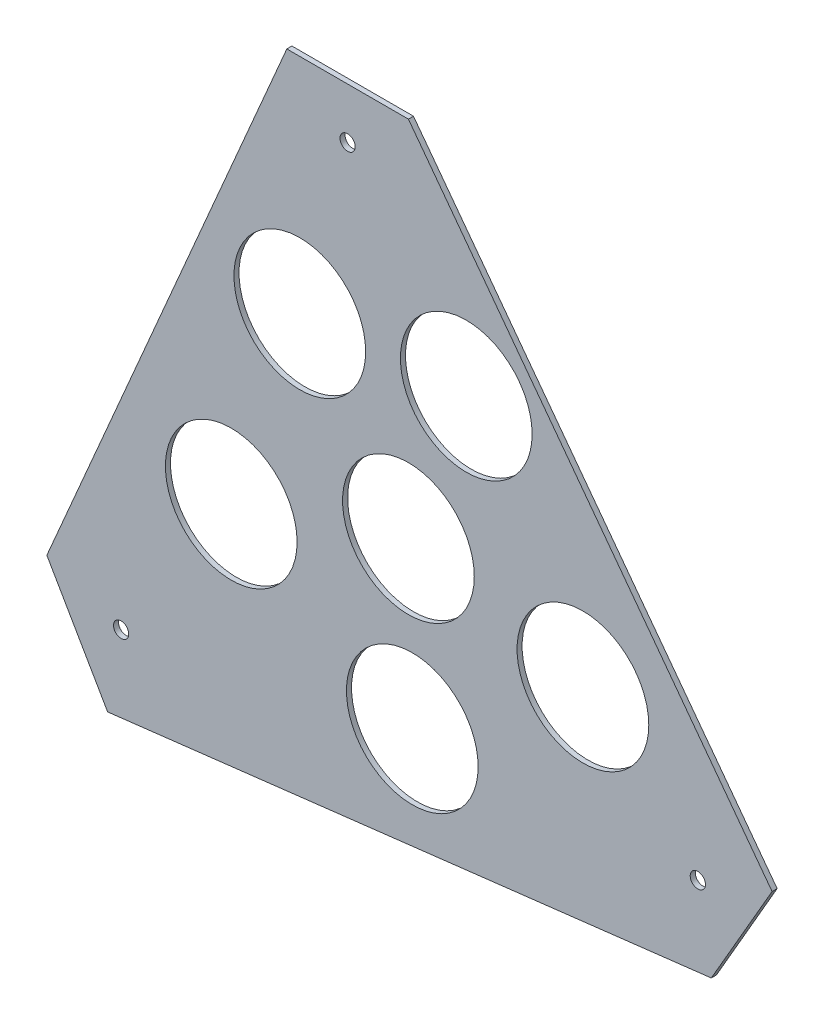
ISO-10303-21;
HEADER;
FILE_DESCRIPTION(('STEP AP214'),'2;1');
FILE_NAME('part.step','',(''),(''),'','','');
FILE_SCHEMA(('AUTOMOTIVE_DESIGN { 1 0 10303 214 1 1 1 1 }'));
ENDSEC;
DATA;
#1=APPLICATION_CONTEXT('core data for automotive mechanical design processes');
#2=APPLICATION_PROTOCOL_DEFINITION('international standard','automotive_design',2000,#1);
#3=PRODUCT_CONTEXT('',#1,'mechanical');
#4=PRODUCT('Part','Part','',(#3));
#5=PRODUCT_RELATED_PRODUCT_CATEGORY('part','',(#4));
#6=PRODUCT_DEFINITION_FORMATION('','',#4);
#7=PRODUCT_DEFINITION_CONTEXT('part definition',#1,'design');
#8=PRODUCT_DEFINITION('design','',#6,#7);
#9=PRODUCT_DEFINITION_SHAPE('','',#8);
#10=(LENGTH_UNIT() NAMED_UNIT(*) SI_UNIT(.MILLI.,.METRE.));
#11=(NAMED_UNIT(*) PLANE_ANGLE_UNIT() SI_UNIT($,.RADIAN.));
#12=(NAMED_UNIT(*) SI_UNIT($,.STERADIAN.) SOLID_ANGLE_UNIT());
#13=UNCERTAINTY_MEASURE_WITH_UNIT(LENGTH_MEASURE(1.E-05),#10,'distance_accuracy_value','');
#14=(GEOMETRIC_REPRESENTATION_CONTEXT(3) GLOBAL_UNCERTAINTY_ASSIGNED_CONTEXT((#13)) GLOBAL_UNIT_ASSIGNED_CONTEXT((#10,
#11,#12)) REPRESENTATION_CONTEXT('',''));
#15=CARTESIAN_POINT('',(0.,0.,0.));
#16=DIRECTION('',(0.,0.,1.));
#17=DIRECTION('',(1.,0.,0.));
#18=AXIS2_PLACEMENT_3D('',#15,#16,#17);
#19=CARTESIAN_POINT('',(0.,0.,1.));
#20=DIRECTION('',(0.,0.,1.));
#21=DIRECTION('',(1.,0.,0.));
#22=AXIS2_PLACEMENT_3D('',#19,#20,#21);
#23=PLANE('',#22);
#24=CARTESIAN_POINT('',(4.62875153001007,-28.1109555220951,1.));
#25=DIRECTION('',(0.,0.,1.));
#26=DIRECTION('',(1.,0.,0.));
#27=AXIS2_PLACEMENT_3D('',#24,#25,#26);
#28=CIRCLE('',#27,13.);
#29=CARTESIAN_POINT('',(17.6287515300101,-28.1109555220951,1.));
#30=VERTEX_POINT('',#29);
#31=EDGE_CURVE('E232',#30,#30,#28,.T.);
#32=ORIENTED_EDGE('',*,*,#31,.F.);
#33=EDGE_LOOP('',(#32));
#34=FACE_BOUND('',#33,.T.);
#35=CARTESIAN_POINT('',(38.3088582525906,-4.13039841220098,1.));
#36=DIRECTION('',(0.,0.,1.));
#37=DIRECTION('',(1.,0.,0.));
#38=AXIS2_PLACEMENT_3D('',#35,#36,#37);
#39=CIRCLE('',#38,13.);
#40=CARTESIAN_POINT('',(51.3088582525906,-4.13039841220098,1.));
#41=VERTEX_POINT('',#40);
#42=EDGE_CURVE('E248',#41,#41,#39,.T.);
#43=ORIENTED_EDGE('',*,*,#42,.F.);
#44=EDGE_LOOP('',(#43));
#45=FACE_BOUND('',#44,.T.);
#46=CARTESIAN_POINT('',(-52.855213252036,-39.9132619393957,1.));
#47=DIRECTION('',(0.,0.,1.));
#48=DIRECTION('',(1.,0.,0.));
#49=AXIS2_PLACEMENT_3D('',#46,#47,#48);
#50=CIRCLE('',#49,1.5);
#51=CARTESIAN_POINT('',(-51.355213252036,-39.9132619393957,1.));
#52=VERTEX_POINT('',#51);
#53=EDGE_CURVE('E264',#52,#52,#50,.T.);
#54=ORIENTED_EDGE('',*,*,#53,.F.);
#55=EDGE_LOOP('',(#54));
#56=FACE_BOUND('',#55,.T.);
#57=CARTESIAN_POINT('',(-17.5802800513365,31.7434955565261,1.));
#58=DIRECTION('',(0.,0.,1.));
#59=DIRECTION('',(1.,0.,0.));
#60=AXIS2_PLACEMENT_3D('',#57,#58,#59);
#61=CIRCLE('',#60,13.);
#62=CARTESIAN_POINT('',(-4.58028005133649,31.7434955565261,1.));
#63=VERTEX_POINT('',#62);
#64=EDGE_CURVE('E280',#63,#63,#61,.T.);
#65=ORIENTED_EDGE('',*,*,#64,.F.);
#66=EDGE_LOOP('',(#65));
#67=FACE_BOUND('',#66,.T.);
#68=DIRECTION('',(-0.598267096772334,0.801296749600049,0.));
#69=VECTOR('',#68,1.);
#70=CARTESIAN_POINT('',(75.6537594512816,-20.4250215835993,1.));
#71=LINE('',#70,#69);
#72=CARTESIAN_POINT('',(75.6537594512816,-20.4250215835993,1.));
#73=VERTEX_POINT('',#72);
#74=CARTESIAN_POINT('',(3.86170783860162,75.7305883684066,1.));
#75=VERTEX_POINT('',#74);
#76=EDGE_CURVE('E146',#73,#75,#71,.T.);
#77=ORIENTED_EDGE('',*,*,#76,.T.);
#78=DIRECTION('',(-1.,0.,0.));
#79=VECTOR('',#78,1.);
#80=CARTESIAN_POINT('',(-20.1382921613984,75.7305883684066,1.));
#81=LINE('',#80,#79);
#82=CARTESIAN_POINT('',(-20.1382921613984,75.7305883684066,1.));
#83=VERTEX_POINT('',#82);
#84=EDGE_CURVE('E94',#75,#83,#81,.T.);
#85=ORIENTED_EDGE('',*,*,#84,.T.);
#86=DIRECTION('',(-0.394809792737374,-0.918762878853228,0.));
#87=VECTOR('',#86,1.);
#88=CARTESIAN_POINT('',(-20.1382921613984,75.7305883684066,1.));
#89=LINE('',#88,#87);
#90=CARTESIAN_POINT('',(-67.5154672898832,-34.5209570939808,1.));
#91=VERTEX_POINT('',#90);
#92=EDGE_CURVE('E107',#83,#91,#89,.T.);
#93=ORIENTED_EDGE('',*,*,#92,.T.);
#94=DIRECTION('',(0.5,-0.866025403784439,0.));
#95=VECTOR('',#94,1.);
#96=CARTESIAN_POINT('',(-55.5154672898832,-55.3055667848074,1.));
#97=LINE('',#96,#95);
#98=CARTESIAN_POINT('',(-55.5154672898832,-55.3055667848074,1.));
#99=VERTEX_POINT('',#98);
#100=EDGE_CURVE('E101',#91,#99,#97,.T.);
#101=ORIENTED_EDGE('',*,*,#100,.T.);
#102=DIRECTION('',(0.993076889509707,0.11746612925318,0.));
#103=VECTOR('',#102,1.);
#104=CARTESIAN_POINT('',(-55.5154672898832,-55.3055667848074,1.));
#105=LINE('',#104,#103);
#106=CARTESIAN_POINT('',(63.6537594512816,-41.2096312744258,1.));
#107=VERTEX_POINT('',#106);
#108=EDGE_CURVE('E105',#99,#107,#105,.T.);
#109=ORIENTED_EDGE('',*,*,#108,.T.);
#110=DIRECTION('',(0.5,0.866025403784439,0.));
#111=VECTOR('',#110,1.);
#112=CARTESIAN_POINT('',(75.6537594512816,-20.4250215835993,1.));
#113=LINE('',#112,#111);
#114=EDGE_CURVE('E57',#107,#73,#113,.T.);
#115=ORIENTED_EDGE('',*,*,#114,.T.);
#116=EDGE_LOOP('',(#77,#85,#93,#101,#109,#115));
#117=FACE_BOUND('',#116,.T.);
#118=CARTESIAN_POINT('',(-8.13829216139838,65.7305883684066,1.));
#119=DIRECTION('',(0.,0.,1.));
#120=DIRECTION('',(1.,0.,0.));
#121=AXIS2_PLACEMENT_3D('',#118,#119,#120);
#122=CIRCLE('',#121,1.5);
#123=CARTESIAN_POINT('',(-6.63829216139838,65.7305883684066,1.));
#124=VERTEX_POINT('',#123);
#125=EDGE_CURVE('E134',#124,#124,#122,.T.);
#126=ORIENTED_EDGE('',*,*,#125,.F.);
#127=EDGE_LOOP('',(#126));
#128=FACE_BOUND('',#127,.T.);
#129=CARTESIAN_POINT('',(60.9935054134401,-25.8173264290109,1.));
#130=DIRECTION('',(0.,0.,1.));
#131=DIRECTION('',(1.,0.,0.));
#132=AXIS2_PLACEMENT_3D('',#129,#130,#131);
#133=CIRCLE('',#132,1.5);
#134=CARTESIAN_POINT('',(62.4935054134401,-25.8173264290109,1.));
#135=VERTEX_POINT('',#134);
#136=EDGE_CURVE('E272',#135,#135,#133,.T.);
#137=ORIENTED_EDGE('',*,*,#136,.F.);
#138=EDGE_LOOP('',(#137));
#139=FACE_BOUND('',#138,.T.);
#140=CARTESIAN_POINT('',(15.2805350980048,34.0733159682998,1.));
#141=DIRECTION('',(0.,0.,1.));
#142=DIRECTION('',(1.,0.,0.));
#143=AXIS2_PLACEMENT_3D('',#140,#141,#142);
#144=CIRCLE('',#143,13.);
#145=CARTESIAN_POINT('',(28.2805350980048,34.0733159682998,1.));
#146=VERTEX_POINT('',#145);
#147=EDGE_CURVE('E256',#146,#146,#144,.T.);
#148=ORIENTED_EDGE('',*,*,#147,.F.);
#149=EDGE_LOOP('',(#148));
#150=FACE_BOUND('',#149,.T.);
#151=CARTESIAN_POINT('',(3.86170783860161,4.0114920209362,1.));
#152=DIRECTION('',(0.,0.,1.));
#153=DIRECTION('',(1.,0.,0.));
#154=AXIS2_PLACEMENT_3D('',#151,#152,#153);
#155=CIRCLE('',#154,13.);
#156=CARTESIAN_POINT('',(16.8617078386016,4.0114920209362,1.));
#157=VERTEX_POINT('',#156);
#158=EDGE_CURVE('E240',#157,#157,#155,.T.);
#159=ORIENTED_EDGE('',*,*,#158,.F.);
#160=EDGE_LOOP('',(#159));
#161=FACE_BOUND('',#160,.T.);
#162=CARTESIAN_POINT('',(-31.1123092879679,-7.57846964765918,1.));
#163=DIRECTION('',(0.,0.,1.));
#164=DIRECTION('',(1.,0.,0.));
#165=AXIS2_PLACEMENT_3D('',#162,#163,#164);
#166=CIRCLE('',#165,13.);
#167=CARTESIAN_POINT('',(-18.1123092879679,-7.57846964765918,1.));
#168=VERTEX_POINT('',#167);
#169=EDGE_CURVE('E221',#168,#168,#166,.T.);
#170=ORIENTED_EDGE('',*,*,#169,.F.);
#171=EDGE_LOOP('',(#170));
#172=FACE_BOUND('',#171,.T.);
#173=ADVANCED_FACE('F39',(#34,#45,#56,#67,#117,#128,#139,#150,#161,#172),#23,.T.);
#174=CARTESIAN_POINT('',(0.,0.,0.));
#175=DIRECTION('',(0.,0.,1.));
#176=DIRECTION('',(1.,0.,0.));
#177=AXIS2_PLACEMENT_3D('',#174,#175,#176);
#178=PLANE('',#177);
#179=DIRECTION('',(-0.598267096772334,0.801296749600049,0.));
#180=VECTOR('',#179,1.);
#181=CARTESIAN_POINT('',(75.6537594512816,-20.4250215835993,0.));
#182=LINE('',#181,#180);
#183=CARTESIAN_POINT('',(75.6537594512816,-20.4250215835993,0.));
#184=VERTEX_POINT('',#183);
#185=CARTESIAN_POINT('',(3.86170783860162,75.7305883684066,0.));
#186=VERTEX_POINT('',#185);
#187=EDGE_CURVE('E129',#184,#186,#182,.T.);
#188=ORIENTED_EDGE('',*,*,#187,.F.);
#189=DIRECTION('',(0.5,0.866025403784439,0.));
#190=VECTOR('',#189,1.);
#191=CARTESIAN_POINT('',(75.6537594512816,-20.4250215835993,0.));
#192=LINE('',#191,#190);
#193=CARTESIAN_POINT('',(63.6537594512816,-41.2096312744258,0.));
#194=VERTEX_POINT('',#193);
#195=EDGE_CURVE('E86',#194,#184,#192,.T.);
#196=ORIENTED_EDGE('',*,*,#195,.F.);
#197=DIRECTION('',(0.993076889509707,0.11746612925318,0.));
#198=VECTOR('',#197,1.);
#199=CARTESIAN_POINT('',(-55.5154672898832,-55.3055667848074,0.));
#200=LINE('',#199,#198);
#201=CARTESIAN_POINT('',(-55.5154672898832,-55.3055667848074,0.));
#202=VERTEX_POINT('',#201);
#203=EDGE_CURVE('E80',#202,#194,#200,.T.);
#204=ORIENTED_EDGE('',*,*,#203,.F.);
#205=DIRECTION('',(0.5,-0.866025403784439,0.));
#206=VECTOR('',#205,1.);
#207=CARTESIAN_POINT('',(-55.5154672898832,-55.3055667848074,0.));
#208=LINE('',#207,#206);
#209=CARTESIAN_POINT('',(-67.5154672898832,-34.5209570939808,0.));
#210=VERTEX_POINT('',#209);
#211=EDGE_CURVE('E116',#210,#202,#208,.T.);
#212=ORIENTED_EDGE('',*,*,#211,.F.);
#213=DIRECTION('',(-0.394809792737374,-0.918762878853228,0.));
#214=VECTOR('',#213,1.);
#215=CARTESIAN_POINT('',(-20.1382921613984,75.7305883684066,0.));
#216=LINE('',#215,#214);
#217=CARTESIAN_POINT('',(-20.1382921613984,75.7305883684066,0.));
#218=VERTEX_POINT('',#217);
#219=EDGE_CURVE('E137',#218,#210,#216,.T.);
#220=ORIENTED_EDGE('',*,*,#219,.F.);
#221=DIRECTION('',(-1.,0.,0.));
#222=VECTOR('',#221,1.);
#223=CARTESIAN_POINT('',(-20.1382921613984,75.7305883684066,0.));
#224=LINE('',#223,#222);
#225=EDGE_CURVE('E133',#186,#218,#224,.T.);
#226=ORIENTED_EDGE('',*,*,#225,.F.);
#227=EDGE_LOOP('',(#188,#196,#204,#212,#220,#226));
#228=FACE_BOUND('',#227,.T.);
#229=CARTESIAN_POINT('',(-8.13829216139838,65.7305883684066,0.));
#230=DIRECTION('',(0.,0.,1.));
#231=DIRECTION('',(1.,0.,0.));
#232=AXIS2_PLACEMENT_3D('',#229,#230,#231);
#233=CIRCLE('',#232,1.5);
#234=CARTESIAN_POINT('',(-6.63829216139838,65.7305883684066,0.));
#235=VERTEX_POINT('',#234);
#236=EDGE_CURVE('E284',#235,#235,#233,.T.);
#237=ORIENTED_EDGE('',*,*,#236,.T.);
#238=EDGE_LOOP('',(#237));
#239=FACE_BOUND('',#238,.T.);
#240=CARTESIAN_POINT('',(-17.5802800513365,31.7434955565261,0.));
#241=DIRECTION('',(0.,0.,1.));
#242=DIRECTION('',(1.,0.,0.));
#243=AXIS2_PLACEMENT_3D('',#240,#241,#242);
#244=CIRCLE('',#243,13.);
#245=CARTESIAN_POINT('',(-4.58028005133649,31.7434955565261,0.));
#246=VERTEX_POINT('',#245);
#247=EDGE_CURVE('E276',#246,#246,#244,.T.);
#248=ORIENTED_EDGE('',*,*,#247,.T.);
#249=EDGE_LOOP('',(#248));
#250=FACE_BOUND('',#249,.T.);
#251=CARTESIAN_POINT('',(60.9935054134401,-25.8173264290109,0.));
#252=DIRECTION('',(0.,0.,1.));
#253=DIRECTION('',(1.,0.,0.));
#254=AXIS2_PLACEMENT_3D('',#251,#252,#253);
#255=CIRCLE('',#254,1.5);
#256=CARTESIAN_POINT('',(62.4935054134401,-25.8173264290109,0.));
#257=VERTEX_POINT('',#256);
#258=EDGE_CURVE('E268',#257,#257,#255,.T.);
#259=ORIENTED_EDGE('',*,*,#258,.T.);
#260=EDGE_LOOP('',(#259));
#261=FACE_BOUND('',#260,.T.);
#262=CARTESIAN_POINT('',(-52.855213252036,-39.9132619393957,0.));
#263=DIRECTION('',(0.,0.,1.));
#264=DIRECTION('',(1.,0.,0.));
#265=AXIS2_PLACEMENT_3D('',#262,#263,#264);
#266=CIRCLE('',#265,1.5);
#267=CARTESIAN_POINT('',(-51.355213252036,-39.9132619393957,0.));
#268=VERTEX_POINT('',#267);
#269=EDGE_CURVE('E260',#268,#268,#266,.T.);
#270=ORIENTED_EDGE('',*,*,#269,.T.);
#271=EDGE_LOOP('',(#270));
#272=FACE_BOUND('',#271,.T.);
#273=CARTESIAN_POINT('',(15.2805350980048,34.0733159682998,0.));
#274=DIRECTION('',(0.,0.,1.));
#275=DIRECTION('',(1.,0.,0.));
#276=AXIS2_PLACEMENT_3D('',#273,#274,#275);
#277=CIRCLE('',#276,13.);
#278=CARTESIAN_POINT('',(28.2805350980048,34.0733159682998,0.));
#279=VERTEX_POINT('',#278);
#280=EDGE_CURVE('E252',#279,#279,#277,.T.);
#281=ORIENTED_EDGE('',*,*,#280,.T.);
#282=EDGE_LOOP('',(#281));
#283=FACE_BOUND('',#282,.T.);
#284=CARTESIAN_POINT('',(38.3088582525906,-4.13039841220098,0.));
#285=DIRECTION('',(0.,0.,1.));
#286=DIRECTION('',(1.,0.,0.));
#287=AXIS2_PLACEMENT_3D('',#284,#285,#286);
#288=CIRCLE('',#287,13.);
#289=CARTESIAN_POINT('',(51.3088582525906,-4.13039841220098,0.));
#290=VERTEX_POINT('',#289);
#291=EDGE_CURVE('E244',#290,#290,#288,.T.);
#292=ORIENTED_EDGE('',*,*,#291,.T.);
#293=EDGE_LOOP('',(#292));
#294=FACE_BOUND('',#293,.T.);
#295=CARTESIAN_POINT('',(3.86170783860161,4.0114920209362,0.));
#296=DIRECTION('',(0.,0.,1.));
#297=DIRECTION('',(1.,0.,0.));
#298=AXIS2_PLACEMENT_3D('',#295,#296,#297);
#299=CIRCLE('',#298,13.);
#300=CARTESIAN_POINT('',(16.8617078386016,4.0114920209362,0.));
#301=VERTEX_POINT('',#300);
#302=EDGE_CURVE('E236',#301,#301,#299,.T.);
#303=ORIENTED_EDGE('',*,*,#302,.T.);
#304=EDGE_LOOP('',(#303));
#305=FACE_BOUND('',#304,.T.);
#306=CARTESIAN_POINT('',(4.62875153001007,-28.1109555220951,0.));
#307=DIRECTION('',(0.,0.,1.));
#308=DIRECTION('',(1.,0.,0.));
#309=AXIS2_PLACEMENT_3D('',#306,#307,#308);
#310=CIRCLE('',#309,13.);
#311=CARTESIAN_POINT('',(17.6287515300101,-28.1109555220951,0.));
#312=VERTEX_POINT('',#311);
#313=EDGE_CURVE('E229',#312,#312,#310,.T.);
#314=ORIENTED_EDGE('',*,*,#313,.T.);
#315=EDGE_LOOP('',(#314));
#316=FACE_BOUND('',#315,.T.);
#317=CARTESIAN_POINT('',(-31.1123092879679,-7.57846964765918,0.));
#318=DIRECTION('',(0.,0.,1.));
#319=DIRECTION('',(1.,0.,0.));
#320=AXIS2_PLACEMENT_3D('',#317,#318,#319);
#321=CIRCLE('',#320,13.);
#322=CARTESIAN_POINT('',(-18.1123092879679,-7.57846964765918,0.));
#323=VERTEX_POINT('',#322);
#324=EDGE_CURVE('E224',#323,#323,#321,.T.);
#325=ORIENTED_EDGE('',*,*,#324,.T.);
#326=EDGE_LOOP('',(#325));
#327=FACE_BOUND('',#326,.T.);
#328=ADVANCED_FACE('F159',(#228,#239,#250,#261,#272,#283,#294,#305,#316,#327),#178,.F.);
#329=CARTESIAN_POINT('',(75.6537594512816,-20.4250215835993,1.));
#330=DIRECTION('',(-0.801296749600049,-0.598267096772334,0.));
#331=DIRECTION('',(0.598267096772334,-0.801296749600049,0.));
#332=AXIS2_PLACEMENT_3D('',#329,#330,#331);
#333=PLANE('',#332);
#334=ORIENTED_EDGE('',*,*,#187,.T.);
#335=DIRECTION('',(0.,0.,-1.));
#336=VECTOR('',#335,1.);
#337=CARTESIAN_POINT('',(3.86170783860162,75.7305883684066,1.));
#338=LINE('',#337,#336);
#339=EDGE_CURVE('E11',#75,#186,#338,.T.);
#340=ORIENTED_EDGE('',*,*,#339,.F.);
#341=ORIENTED_EDGE('',*,*,#76,.F.);
#342=DIRECTION('',(0.,0.,-1.));
#343=VECTOR('',#342,1.);
#344=CARTESIAN_POINT('',(75.6537594512816,-20.4250215835993,1.));
#345=LINE('',#344,#343);
#346=EDGE_CURVE('E125',#73,#184,#345,.T.);
#347=ORIENTED_EDGE('',*,*,#346,.T.);
#348=EDGE_LOOP('',(#334,#340,#341,#347));
#349=FACE_BOUND('',#348,.T.);
#350=ADVANCED_FACE('F41',(#349),#333,.F.);
#351=CARTESIAN_POINT('',(-20.1382921613984,75.7305883684066,1.));
#352=DIRECTION('',(0.,-1.,0.));
#353=DIRECTION('',(0.,0.,-1.));
#354=AXIS2_PLACEMENT_3D('',#351,#352,#353);
#355=PLANE('',#354);
#356=ORIENTED_EDGE('',*,*,#225,.T.);
#357=DIRECTION('',(0.,0.,-1.));
#358=VECTOR('',#357,1.);
#359=CARTESIAN_POINT('',(-20.1382921613984,75.7305883684066,1.));
#360=LINE('',#359,#358);
#361=EDGE_CURVE('E49',#83,#218,#360,.T.);
#362=ORIENTED_EDGE('',*,*,#361,.F.);
#363=ORIENTED_EDGE('',*,*,#84,.F.);
#364=ORIENTED_EDGE('',*,*,#339,.T.);
#365=EDGE_LOOP('',(#356,#362,#363,#364));
#366=FACE_BOUND('',#365,.T.);
#367=ADVANCED_FACE('F393',(#366),#355,.F.);
#368=CARTESIAN_POINT('',(-20.1382921613984,75.7305883684066,1.));
#369=DIRECTION('',(0.918762878853228,-0.394809792737374,0.));
#370=DIRECTION('',(0.394809792737374,0.918762878853228,0.));
#371=AXIS2_PLACEMENT_3D('',#368,#369,#370);
#372=PLANE('',#371);
#373=ORIENTED_EDGE('',*,*,#219,.T.);
#374=DIRECTION('',(0.,0.,-1.));
#375=VECTOR('',#374,1.);
#376=CARTESIAN_POINT('',(-67.5154672898832,-34.5209570939808,1.));
#377=LINE('',#376,#375);
#378=EDGE_CURVE('E118',#91,#210,#377,.T.);
#379=ORIENTED_EDGE('',*,*,#378,.F.);
#380=ORIENTED_EDGE('',*,*,#92,.F.);
#381=ORIENTED_EDGE('',*,*,#361,.T.);
#382=EDGE_LOOP('',(#373,#379,#380,#381));
#383=FACE_BOUND('',#382,.T.);
#384=ADVANCED_FACE('F156',(#383),#372,.F.);
#385=CARTESIAN_POINT('',(-55.5154672898832,-55.3055667848074,1.));
#386=DIRECTION('',(0.866025403784439,0.5,0.));
#387=DIRECTION('',(-0.5,0.866025403784439,0.));
#388=AXIS2_PLACEMENT_3D('',#385,#386,#387);
#389=PLANE('',#388);
#390=ORIENTED_EDGE('',*,*,#211,.T.);
#391=DIRECTION('',(0.,0.,-1.));
#392=VECTOR('',#391,1.);
#393=CARTESIAN_POINT('',(-55.5154672898832,-55.3055667848074,1.));
#394=LINE('',#393,#392);
#395=EDGE_CURVE('E113',#99,#202,#394,.T.);
#396=ORIENTED_EDGE('',*,*,#395,.F.);
#397=ORIENTED_EDGE('',*,*,#100,.F.);
#398=ORIENTED_EDGE('',*,*,#378,.T.);
#399=EDGE_LOOP('',(#390,#396,#397,#398));
#400=FACE_BOUND('',#399,.T.);
#401=ADVANCED_FACE('F114',(#400),#389,.F.);
#402=CARTESIAN_POINT('',(-55.5154672898832,-55.3055667848074,1.));
#403=DIRECTION('',(-0.11746612925318,0.993076889509707,0.));
#404=DIRECTION('',(-0.993076889509707,-0.11746612925318,0.));
#405=AXIS2_PLACEMENT_3D('',#402,#403,#404);
#406=PLANE('',#405);
#407=ORIENTED_EDGE('',*,*,#203,.T.);
#408=DIRECTION('',(0.,0.,-1.));
#409=VECTOR('',#408,1.);
#410=CARTESIAN_POINT('',(63.6537594512816,-41.2096312744258,1.));
#411=LINE('',#410,#409);
#412=EDGE_CURVE('E119',#107,#194,#411,.T.);
#413=ORIENTED_EDGE('',*,*,#412,.F.);
#414=ORIENTED_EDGE('',*,*,#108,.F.);
#415=ORIENTED_EDGE('',*,*,#395,.T.);
#416=EDGE_LOOP('',(#407,#413,#414,#415));
#417=FACE_BOUND('',#416,.T.);
#418=ADVANCED_FACE('F121',(#417),#406,.F.);
#419=CARTESIAN_POINT('',(75.6537594512816,-20.4250215835993,1.));
#420=DIRECTION('',(-0.866025403784439,0.5,0.));
#421=DIRECTION('',(-0.5,-0.866025403784439,0.));
#422=AXIS2_PLACEMENT_3D('',#419,#420,#421);
#423=PLANE('',#422);
#424=ORIENTED_EDGE('',*,*,#195,.T.);
#425=ORIENTED_EDGE('',*,*,#346,.F.);
#426=ORIENTED_EDGE('',*,*,#114,.F.);
#427=ORIENTED_EDGE('',*,*,#412,.T.);
#428=EDGE_LOOP('',(#424,#425,#426,#427));
#429=FACE_BOUND('',#428,.T.);
#430=ADVANCED_FACE('F164',(#429),#423,.F.);
#431=CARTESIAN_POINT('',(-8.13829216139838,65.7305883684066,1.));
#432=DIRECTION('',(0.,0.,-1.));
#433=DIRECTION('',(-1.,0.,0.));
#434=AXIS2_PLACEMENT_3D('',#431,#432,#433);
#435=CYLINDRICAL_SURFACE('',#434,1.5);
#436=ORIENTED_EDGE('',*,*,#125,.T.);
#437=EDGE_LOOP('',(#436));
#438=FACE_BOUND('',#437,.T.);
#439=ORIENTED_EDGE('',*,*,#236,.F.);
#440=EDGE_LOOP('',(#439));
#441=FACE_BOUND('',#440,.T.);
#442=ADVANCED_FACE('F166',(#438,#441),#435,.F.);
#443=CARTESIAN_POINT('',(-17.5802800513365,31.7434955565261,1.));
#444=DIRECTION('',(0.,0.,-1.));
#445=DIRECTION('',(-1.,0.,0.));
#446=AXIS2_PLACEMENT_3D('',#443,#444,#445);
#447=CYLINDRICAL_SURFACE('',#446,13.);
#448=ORIENTED_EDGE('',*,*,#64,.T.);
#449=EDGE_LOOP('',(#448));
#450=FACE_BOUND('',#449,.T.);
#451=ORIENTED_EDGE('',*,*,#247,.F.);
#452=EDGE_LOOP('',(#451));
#453=FACE_BOUND('',#452,.T.);
#454=ADVANCED_FACE('F172',(#450,#453),#447,.F.);
#455=CARTESIAN_POINT('',(60.9935054134401,-25.8173264290109,1.));
#456=DIRECTION('',(0.,0.,-1.));
#457=DIRECTION('',(-1.,0.,0.));
#458=AXIS2_PLACEMENT_3D('',#455,#456,#457);
#459=CYLINDRICAL_SURFACE('',#458,1.5);
#460=ORIENTED_EDGE('',*,*,#136,.T.);
#461=EDGE_LOOP('',(#460));
#462=FACE_BOUND('',#461,.T.);
#463=ORIENTED_EDGE('',*,*,#258,.F.);
#464=EDGE_LOOP('',(#463));
#465=FACE_BOUND('',#464,.T.);
#466=ADVANCED_FACE('F188',(#462,#465),#459,.F.);
#467=CARTESIAN_POINT('',(-52.855213252036,-39.9132619393957,1.));
#468=DIRECTION('',(0.,0.,-1.));
#469=DIRECTION('',(-1.,0.,0.));
#470=AXIS2_PLACEMENT_3D('',#467,#468,#469);
#471=CYLINDRICAL_SURFACE('',#470,1.5);
#472=ORIENTED_EDGE('',*,*,#53,.T.);
#473=EDGE_LOOP('',(#472));
#474=FACE_BOUND('',#473,.T.);
#475=ORIENTED_EDGE('',*,*,#269,.F.);
#476=EDGE_LOOP('',(#475));
#477=FACE_BOUND('',#476,.T.);
#478=ADVANCED_FACE('F192',(#474,#477),#471,.F.);
#479=CARTESIAN_POINT('',(15.2805350980048,34.0733159682998,1.));
#480=DIRECTION('',(0.,0.,-1.));
#481=DIRECTION('',(-1.,0.,0.));
#482=AXIS2_PLACEMENT_3D('',#479,#480,#481);
#483=CYLINDRICAL_SURFACE('',#482,13.);
#484=ORIENTED_EDGE('',*,*,#147,.T.);
#485=EDGE_LOOP('',(#484));
#486=FACE_BOUND('',#485,.T.);
#487=ORIENTED_EDGE('',*,*,#280,.F.);
#488=EDGE_LOOP('',(#487));
#489=FACE_BOUND('',#488,.T.);
#490=ADVANCED_FACE('F196',(#486,#489),#483,.F.);
#491=CARTESIAN_POINT('',(38.3088582525906,-4.13039841220098,1.));
#492=DIRECTION('',(0.,0.,-1.));
#493=DIRECTION('',(-1.,0.,0.));
#494=AXIS2_PLACEMENT_3D('',#491,#492,#493);
#495=CYLINDRICAL_SURFACE('',#494,13.);
#496=ORIENTED_EDGE('',*,*,#42,.T.);
#497=EDGE_LOOP('',(#496));
#498=FACE_BOUND('',#497,.T.);
#499=ORIENTED_EDGE('',*,*,#291,.F.);
#500=EDGE_LOOP('',(#499));
#501=FACE_BOUND('',#500,.T.);
#502=ADVANCED_FACE('F200',(#498,#501),#495,.F.);
#503=CARTESIAN_POINT('',(3.86170783860161,4.0114920209362,1.));
#504=DIRECTION('',(0.,0.,-1.));
#505=DIRECTION('',(-1.,0.,0.));
#506=AXIS2_PLACEMENT_3D('',#503,#504,#505);
#507=CYLINDRICAL_SURFACE('',#506,13.);
#508=ORIENTED_EDGE('',*,*,#158,.T.);
#509=EDGE_LOOP('',(#508));
#510=FACE_BOUND('',#509,.T.);
#511=ORIENTED_EDGE('',*,*,#302,.F.);
#512=EDGE_LOOP('',(#511));
#513=FACE_BOUND('',#512,.T.);
#514=ADVANCED_FACE('F204',(#510,#513),#507,.F.);
#515=CARTESIAN_POINT('',(4.62875153001007,-28.1109555220951,1.));
#516=DIRECTION('',(0.,0.,-1.));
#517=DIRECTION('',(-1.,0.,0.));
#518=AXIS2_PLACEMENT_3D('',#515,#516,#517);
#519=CYLINDRICAL_SURFACE('',#518,13.);
#520=ORIENTED_EDGE('',*,*,#31,.T.);
#521=EDGE_LOOP('',(#520));
#522=FACE_BOUND('',#521,.T.);
#523=ORIENTED_EDGE('',*,*,#313,.F.);
#524=EDGE_LOOP('',(#523));
#525=FACE_BOUND('',#524,.T.);
#526=ADVANCED_FACE('F208',(#522,#525),#519,.F.);
#527=CARTESIAN_POINT('',(-31.1123092879679,-7.57846964765918,1.));
#528=DIRECTION('',(0.,0.,-1.));
#529=DIRECTION('',(-1.,0.,0.));
#530=AXIS2_PLACEMENT_3D('',#527,#528,#529);
#531=CYLINDRICAL_SURFACE('',#530,13.);
#532=ORIENTED_EDGE('',*,*,#169,.T.);
#533=EDGE_LOOP('',(#532));
#534=FACE_BOUND('',#533,.T.);
#535=ORIENTED_EDGE('',*,*,#324,.F.);
#536=EDGE_LOOP('',(#535));
#537=FACE_BOUND('',#536,.T.);
#538=ADVANCED_FACE('F212',(#534,#537),#531,.F.);
#539=CLOSED_SHELL('',(#173,#328,#350,#367,#384,#401,#418,#430,#442,#454,#466,#478,#490,#502,
#514,#526,#538));
#540=MANIFOLD_SOLID_BREP('B2',#539);
#541=ADVANCED_BREP_SHAPE_REPRESENTATION('',(#18,#540),#14);
#542=SHAPE_DEFINITION_REPRESENTATION(#9,#541);
ENDSEC;
END-ISO-10303-21;
